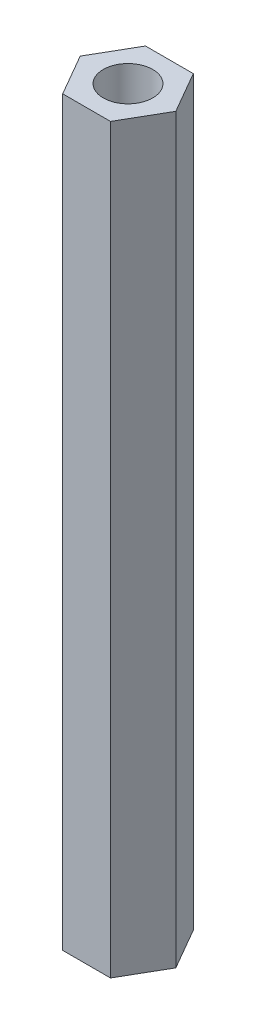
ISO-10303-21;
HEADER;
FILE_DESCRIPTION(('STEP AP214'),'2;1');
FILE_NAME('part.step','',(''),(''),'','','');
FILE_SCHEMA(('AUTOMOTIVE_DESIGN { 1 0 10303 214 1 1 1 1 }'));
ENDSEC;
DATA;
#1=APPLICATION_CONTEXT('core data for automotive mechanical design processes');
#2=APPLICATION_PROTOCOL_DEFINITION('international standard','automotive_design',2000,#1);
#3=PRODUCT_CONTEXT('',#1,'mechanical');
#4=PRODUCT('Part','Part','',(#3));
#5=PRODUCT_RELATED_PRODUCT_CATEGORY('part','',(#4));
#6=PRODUCT_DEFINITION_FORMATION('','',#4);
#7=PRODUCT_DEFINITION_CONTEXT('part definition',#1,'design');
#8=PRODUCT_DEFINITION('design','',#6,#7);
#9=PRODUCT_DEFINITION_SHAPE('','',#8);
#10=(LENGTH_UNIT() NAMED_UNIT(*) SI_UNIT(.MILLI.,.METRE.));
#11=(NAMED_UNIT(*) PLANE_ANGLE_UNIT() SI_UNIT($,.RADIAN.));
#12=(NAMED_UNIT(*) SI_UNIT($,.STERADIAN.) SOLID_ANGLE_UNIT());
#13=UNCERTAINTY_MEASURE_WITH_UNIT(LENGTH_MEASURE(1.E-05),#10,'distance_accuracy_value','');
#14=(GEOMETRIC_REPRESENTATION_CONTEXT(3) GLOBAL_UNCERTAINTY_ASSIGNED_CONTEXT((#13)) GLOBAL_UNIT_ASSIGNED_CONTEXT((#10,
#11,#12)) REPRESENTATION_CONTEXT('',''));
#15=CARTESIAN_POINT('',(0.,0.,0.));
#16=DIRECTION('',(0.,0.,1.));
#17=DIRECTION('',(1.,0.,0.));
#18=AXIS2_PLACEMENT_3D('',#15,#16,#17);
#19=CARTESIAN_POINT('',(1.45,45.,2.51147367097487));
#20=DIRECTION('',(-0.866025403784439,0.,-0.5));
#21=DIRECTION('',(-0.5,0.,0.866025403784439));
#22=AXIS2_PLACEMENT_3D('',#19,#20,#21);
#23=PLANE('',#22);
#24=DIRECTION('',(0.5,0.,-0.866025403784439));
#25=VECTOR('',#24,1.);
#26=CARTESIAN_POINT('',(1.45,0.,2.51147367097487));
#27=LINE('',#26,#25);
#28=CARTESIAN_POINT('',(1.45,0.,2.51147367097487));
#29=VERTEX_POINT('',#28);
#30=CARTESIAN_POINT('',(2.9,0.,0.));
#31=VERTEX_POINT('',#30);
#32=EDGE_CURVE('E134',#29,#31,#27,.T.);
#33=ORIENTED_EDGE('',*,*,#32,.T.);
#34=DIRECTION('',(0.,-1.,0.));
#35=VECTOR('',#34,1.);
#36=CARTESIAN_POINT('',(2.9,45.,0.));
#37=LINE('',#36,#35);
#38=CARTESIAN_POINT('',(2.9,45.,0.));
#39=VERTEX_POINT('',#38);
#40=EDGE_CURVE('E11',#39,#31,#37,.T.);
#41=ORIENTED_EDGE('',*,*,#40,.F.);
#42=DIRECTION('',(0.5,0.,-0.866025403784439));
#43=VECTOR('',#42,1.);
#44=CARTESIAN_POINT('',(1.45,45.,2.51147367097487));
#45=LINE('',#44,#43);
#46=CARTESIAN_POINT('',(1.45,45.,2.51147367097487));
#47=VERTEX_POINT('',#46);
#48=EDGE_CURVE('E151',#47,#39,#45,.T.);
#49=ORIENTED_EDGE('',*,*,#48,.F.);
#50=DIRECTION('',(0.,-1.,0.));
#51=VECTOR('',#50,1.);
#52=CARTESIAN_POINT('',(1.45,45.,2.51147367097487));
#53=LINE('',#52,#51);
#54=EDGE_CURVE('E130',#47,#29,#53,.T.);
#55=ORIENTED_EDGE('',*,*,#54,.T.);
#56=EDGE_LOOP('',(#33,#41,#49,#55));
#57=FACE_BOUND('',#56,.T.);
#58=ADVANCED_FACE('F45',(#57),#23,.F.);
#59=CARTESIAN_POINT('',(2.9,45.,0.));
#60=DIRECTION('',(-0.866025403784439,0.,0.5));
#61=DIRECTION('',(0.5,0.,0.866025403784439));
#62=AXIS2_PLACEMENT_3D('',#59,#60,#61);
#63=PLANE('',#62);
#64=DIRECTION('',(-0.5,0.,-0.866025403784439));
#65=VECTOR('',#64,1.);
#66=CARTESIAN_POINT('',(2.9,0.,0.));
#67=LINE('',#66,#65);
#68=CARTESIAN_POINT('',(1.45,0.,-2.51147367097487));
#69=VERTEX_POINT('',#68);
#70=EDGE_CURVE('E138',#31,#69,#67,.T.);
#71=ORIENTED_EDGE('',*,*,#70,.T.);
#72=DIRECTION('',(0.,-1.,0.));
#73=VECTOR('',#72,1.);
#74=CARTESIAN_POINT('',(1.45,45.,-2.51147367097487));
#75=LINE('',#74,#73);
#76=CARTESIAN_POINT('',(1.45,45.,-2.51147367097487));
#77=VERTEX_POINT('',#76);
#78=EDGE_CURVE('E54',#77,#69,#75,.T.);
#79=ORIENTED_EDGE('',*,*,#78,.F.);
#80=DIRECTION('',(-0.5,0.,-0.866025403784439));
#81=VECTOR('',#80,1.);
#82=CARTESIAN_POINT('',(2.9,45.,0.));
#83=LINE('',#82,#81);
#84=EDGE_CURVE('E99',#39,#77,#83,.T.);
#85=ORIENTED_EDGE('',*,*,#84,.F.);
#86=ORIENTED_EDGE('',*,*,#40,.T.);
#87=EDGE_LOOP('',(#71,#79,#85,#86));
#88=FACE_BOUND('',#87,.T.);
#89=ADVANCED_FACE('F180',(#88),#63,.F.);
#90=CARTESIAN_POINT('',(1.45,45.,-2.51147367097487));
#91=DIRECTION('',(0.,0.,1.));
#92=DIRECTION('',(1.,0.,0.));
#93=AXIS2_PLACEMENT_3D('',#90,#91,#92);
#94=PLANE('',#93);
#95=DIRECTION('',(-1.,0.,0.));
#96=VECTOR('',#95,1.);
#97=CARTESIAN_POINT('',(1.45,0.,-2.51147367097487));
#98=LINE('',#97,#96);
#99=CARTESIAN_POINT('',(-1.45,0.,-2.51147367097487));
#100=VERTEX_POINT('',#99);
#101=EDGE_CURVE('E142',#69,#100,#98,.T.);
#102=ORIENTED_EDGE('',*,*,#101,.T.);
#103=DIRECTION('',(0.,-1.,0.));
#104=VECTOR('',#103,1.);
#105=CARTESIAN_POINT('',(-1.45,45.,-2.51147367097487));
#106=LINE('',#105,#104);
#107=CARTESIAN_POINT('',(-1.45,45.,-2.51147367097487));
#108=VERTEX_POINT('',#107);
#109=EDGE_CURVE('E123',#108,#100,#106,.T.);
#110=ORIENTED_EDGE('',*,*,#109,.F.);
#111=DIRECTION('',(-1.,0.,0.));
#112=VECTOR('',#111,1.);
#113=CARTESIAN_POINT('',(1.45,45.,-2.51147367097487));
#114=LINE('',#113,#112);
#115=EDGE_CURVE('E112',#77,#108,#114,.T.);
#116=ORIENTED_EDGE('',*,*,#115,.F.);
#117=ORIENTED_EDGE('',*,*,#78,.T.);
#118=EDGE_LOOP('',(#102,#110,#116,#117));
#119=FACE_BOUND('',#118,.T.);
#120=ADVANCED_FACE('F161',(#119),#94,.F.);
#121=CARTESIAN_POINT('',(-1.45,45.,-2.51147367097487));
#122=DIRECTION('',(0.866025403784439,0.,0.5));
#123=DIRECTION('',(0.5,0.,-0.866025403784439));
#124=AXIS2_PLACEMENT_3D('',#121,#122,#123);
#125=PLANE('',#124);
#126=DIRECTION('',(-0.5,0.,0.866025403784439));
#127=VECTOR('',#126,1.);
#128=CARTESIAN_POINT('',(-1.45,0.,-2.51147367097487));
#129=LINE('',#128,#127);
#130=CARTESIAN_POINT('',(-2.9,0.,0.));
#131=VERTEX_POINT('',#130);
#132=EDGE_CURVE('E121',#100,#131,#129,.T.);
#133=ORIENTED_EDGE('',*,*,#132,.T.);
#134=DIRECTION('',(0.,-1.,0.));
#135=VECTOR('',#134,1.);
#136=CARTESIAN_POINT('',(-2.9,45.,0.));
#137=LINE('',#136,#135);
#138=CARTESIAN_POINT('',(-2.9,45.,0.));
#139=VERTEX_POINT('',#138);
#140=EDGE_CURVE('E118',#139,#131,#137,.T.);
#141=ORIENTED_EDGE('',*,*,#140,.F.);
#142=DIRECTION('',(-0.5,0.,0.866025403784439));
#143=VECTOR('',#142,1.);
#144=CARTESIAN_POINT('',(-1.45,45.,-2.51147367097487));
#145=LINE('',#144,#143);
#146=EDGE_CURVE('E106',#108,#139,#145,.T.);
#147=ORIENTED_EDGE('',*,*,#146,.F.);
#148=ORIENTED_EDGE('',*,*,#109,.T.);
#149=EDGE_LOOP('',(#133,#141,#147,#148));
#150=FACE_BOUND('',#149,.T.);
#151=ADVANCED_FACE('F119',(#150),#125,.F.);
#152=CARTESIAN_POINT('',(-2.9,45.,0.));
#153=DIRECTION('',(0.866025403784439,0.,-0.5));
#154=DIRECTION('',(-0.5,0.,-0.866025403784439));
#155=AXIS2_PLACEMENT_3D('',#152,#153,#154);
#156=PLANE('',#155);
#157=DIRECTION('',(0.5,0.,0.866025403784439));
#158=VECTOR('',#157,1.);
#159=CARTESIAN_POINT('',(-2.9,0.,0.));
#160=LINE('',#159,#158);
#161=CARTESIAN_POINT('',(-1.45,0.,2.51147367097487));
#162=VERTEX_POINT('',#161);
#163=EDGE_CURVE('E85',#131,#162,#160,.T.);
#164=ORIENTED_EDGE('',*,*,#163,.T.);
#165=DIRECTION('',(0.,-1.,0.));
#166=VECTOR('',#165,1.);
#167=CARTESIAN_POINT('',(-1.45,45.,2.51147367097487));
#168=LINE('',#167,#166);
#169=CARTESIAN_POINT('',(-1.45,45.,2.51147367097487));
#170=VERTEX_POINT('',#169);
#171=EDGE_CURVE('E124',#170,#162,#168,.T.);
#172=ORIENTED_EDGE('',*,*,#171,.F.);
#173=DIRECTION('',(0.5,0.,0.866025403784439));
#174=VECTOR('',#173,1.);
#175=CARTESIAN_POINT('',(-2.9,45.,0.));
#176=LINE('',#175,#174);
#177=EDGE_CURVE('E110',#139,#170,#176,.T.);
#178=ORIENTED_EDGE('',*,*,#177,.F.);
#179=ORIENTED_EDGE('',*,*,#140,.T.);
#180=EDGE_LOOP('',(#164,#172,#178,#179));
#181=FACE_BOUND('',#180,.T.);
#182=ADVANCED_FACE('F126',(#181),#156,.F.);
#183=CARTESIAN_POINT('',(-1.45,45.,2.51147367097487));
#184=DIRECTION('',(0.,0.,-1.));
#185=DIRECTION('',(-1.,0.,0.));
#186=AXIS2_PLACEMENT_3D('',#183,#184,#185);
#187=PLANE('',#186);
#188=DIRECTION('',(1.,0.,0.));
#189=VECTOR('',#188,1.);
#190=CARTESIAN_POINT('',(-1.45,0.,2.51147367097487));
#191=LINE('',#190,#189);
#192=EDGE_CURVE('E91',#162,#29,#191,.T.);
#193=ORIENTED_EDGE('',*,*,#192,.T.);
#194=ORIENTED_EDGE('',*,*,#54,.F.);
#195=DIRECTION('',(1.,0.,0.));
#196=VECTOR('',#195,1.);
#197=CARTESIAN_POINT('',(-1.45,45.,2.51147367097487));
#198=LINE('',#197,#196);
#199=EDGE_CURVE('E62',#170,#47,#198,.T.);
#200=ORIENTED_EDGE('',*,*,#199,.F.);
#201=ORIENTED_EDGE('',*,*,#171,.T.);
#202=EDGE_LOOP('',(#193,#194,#200,#201));
#203=FACE_BOUND('',#202,.T.);
#204=ADVANCED_FACE('F168',(#203),#187,.F.);
#205=CARTESIAN_POINT('',(0.,45.,0.));
#206=DIRECTION('',(0.,1.,0.));
#207=DIRECTION('',(0.,0.,1.));
#208=AXIS2_PLACEMENT_3D('',#205,#206,#207);
#209=PLANE('',#208);
#210=CARTESIAN_POINT('',(0.,45.,0.));
#211=DIRECTION('',(0.,1.,0.));
#212=DIRECTION('',(0.,0.,1.));
#213=AXIS2_PLACEMENT_3D('',#210,#211,#212);
#214=CIRCLE('',#213,1.5);
#215=CARTESIAN_POINT('',(0.,45.,1.5));
#216=VERTEX_POINT('',#215);
#217=EDGE_CURVE('E236',#216,#216,#214,.T.);
#218=ORIENTED_EDGE('',*,*,#217,.F.);
#219=EDGE_LOOP('',(#218));
#220=FACE_BOUND('',#219,.T.);
#221=ORIENTED_EDGE('',*,*,#48,.T.);
#222=ORIENTED_EDGE('',*,*,#84,.T.);
#223=ORIENTED_EDGE('',*,*,#115,.T.);
#224=ORIENTED_EDGE('',*,*,#146,.T.);
#225=ORIENTED_EDGE('',*,*,#177,.T.);
#226=ORIENTED_EDGE('',*,*,#199,.T.);
#227=EDGE_LOOP('',(#221,#222,#223,#224,#225,#226));
#228=FACE_BOUND('',#227,.T.);
#229=ADVANCED_FACE('F108',(#220,#228),#209,.T.);
#230=CARTESIAN_POINT('',(0.,0.,0.));
#231=DIRECTION('',(0.,1.,0.));
#232=DIRECTION('',(0.,0.,1.));
#233=AXIS2_PLACEMENT_3D('',#230,#231,#232);
#234=PLANE('',#233);
#235=CARTESIAN_POINT('',(0.,0.,0.));
#236=DIRECTION('',(0.,1.,0.));
#237=DIRECTION('',(0.,0.,1.));
#238=AXIS2_PLACEMENT_3D('',#235,#236,#237);
#239=CIRCLE('',#238,1.5);
#240=CARTESIAN_POINT('',(0.,0.,1.5));
#241=VERTEX_POINT('',#240);
#242=EDGE_CURVE('E139',#241,#241,#239,.T.);
#243=ORIENTED_EDGE('',*,*,#242,.T.);
#244=EDGE_LOOP('',(#243));
#245=FACE_BOUND('',#244,.T.);
#246=ORIENTED_EDGE('',*,*,#32,.F.);
#247=ORIENTED_EDGE('',*,*,#192,.F.);
#248=ORIENTED_EDGE('',*,*,#163,.F.);
#249=ORIENTED_EDGE('',*,*,#132,.F.);
#250=ORIENTED_EDGE('',*,*,#101,.F.);
#251=ORIENTED_EDGE('',*,*,#70,.F.);
#252=EDGE_LOOP('',(#246,#247,#248,#249,#250,#251));
#253=FACE_BOUND('',#252,.T.);
#254=ADVANCED_FACE('F164',(#245,#253),#234,.F.);
#255=CARTESIAN_POINT('',(0.,0.,0.));
#256=DIRECTION('',(0.,1.,0.));
#257=DIRECTION('',(0.,0.,1.));
#258=AXIS2_PLACEMENT_3D('',#255,#256,#257);
#259=CYLINDRICAL_SURFACE('',#258,1.5);
#260=CARTESIAN_POINT('',(0.,0.,1.5));
#261=CARTESIAN_POINT('',(0.,0.468749999999999,1.5));
#262=CARTESIAN_POINT('',(0.,0.9375,1.5));
#263=CARTESIAN_POINT('',(0.,1.875,1.5));
#264=CARTESIAN_POINT('',(0.,2.34375,1.5));
#265=CARTESIAN_POINT('',(0.,3.28125,1.5));
#266=CARTESIAN_POINT('',(0.,3.75,1.5));
#267=CARTESIAN_POINT('',(0.,4.6875,1.5));
#268=CARTESIAN_POINT('',(0.,5.15625,1.5));
#269=CARTESIAN_POINT('',(0.,6.09375,1.5));
#270=CARTESIAN_POINT('',(0.,6.5625,1.5));
#271=CARTESIAN_POINT('',(0.,7.5,1.5));
#272=CARTESIAN_POINT('',(0.,7.96875,1.5));
#273=CARTESIAN_POINT('',(0.,8.90625,1.5));
#274=CARTESIAN_POINT('',(0.,9.375,1.5));
#275=CARTESIAN_POINT('',(0.,10.3125,1.5));
#276=CARTESIAN_POINT('',(0.,10.78125,1.5));
#277=CARTESIAN_POINT('',(0.,11.71875,1.5));
#278=CARTESIAN_POINT('',(0.,12.1875,1.5));
#279=CARTESIAN_POINT('',(0.,13.125,1.5));
#280=CARTESIAN_POINT('',(0.,13.59375,1.5));
#281=CARTESIAN_POINT('',(0.,14.53125,1.5));
#282=CARTESIAN_POINT('',(0.,15.,1.5));
#283=CARTESIAN_POINT('',(0.,15.9375,1.5));
#284=CARTESIAN_POINT('',(0.,16.40625,1.5));
#285=CARTESIAN_POINT('',(0.,17.34375,1.5));
#286=CARTESIAN_POINT('',(0.,17.8125,1.5));
#287=CARTESIAN_POINT('',(0.,18.75,1.5));
#288=CARTESIAN_POINT('',(0.,19.21875,1.5));
#289=CARTESIAN_POINT('',(0.,20.15625,1.5));
#290=CARTESIAN_POINT('',(0.,20.625,1.5));
#291=CARTESIAN_POINT('',(0.,21.5625,1.5));
#292=CARTESIAN_POINT('',(0.,22.03125,1.5));
#293=CARTESIAN_POINT('',(0.,22.96875,1.5));
#294=CARTESIAN_POINT('',(0.,23.4375,1.5));
#295=CARTESIAN_POINT('',(0.,24.375,1.5));
#296=CARTESIAN_POINT('',(0.,24.84375,1.5));
#297=CARTESIAN_POINT('',(0.,25.78125,1.5));
#298=CARTESIAN_POINT('',(0.,26.25,1.5));
#299=CARTESIAN_POINT('',(0.,27.1875,1.5));
#300=CARTESIAN_POINT('',(0.,27.65625,1.5));
#301=CARTESIAN_POINT('',(0.,28.59375,1.5));
#302=CARTESIAN_POINT('',(0.,29.0625,1.5));
#303=CARTESIAN_POINT('',(0.,30.,1.5));
#304=CARTESIAN_POINT('',(0.,30.46875,1.5));
#305=CARTESIAN_POINT('',(0.,31.40625,1.5));
#306=CARTESIAN_POINT('',(0.,31.875,1.5));
#307=CARTESIAN_POINT('',(0.,32.8125,1.5));
#308=CARTESIAN_POINT('',(0.,33.28125,1.5));
#309=CARTESIAN_POINT('',(0.,34.21875,1.5));
#310=CARTESIAN_POINT('',(0.,34.6875,1.5));
#311=CARTESIAN_POINT('',(0.,35.625,1.5));
#312=CARTESIAN_POINT('',(0.,36.09375,1.5));
#313=CARTESIAN_POINT('',(0.,37.03125,1.5));
#314=CARTESIAN_POINT('',(0.,37.5,1.5));
#315=CARTESIAN_POINT('',(0.,38.4375,1.5));
#316=CARTESIAN_POINT('',(0.,38.90625,1.5));
#317=CARTESIAN_POINT('',(0.,39.84375,1.5));
#318=CARTESIAN_POINT('',(0.,40.3125,1.5));
#319=CARTESIAN_POINT('',(0.,41.25,1.5));
#320=CARTESIAN_POINT('',(0.,41.71875,1.5));
#321=CARTESIAN_POINT('',(0.,42.65625,1.5));
#322=CARTESIAN_POINT('',(0.,43.125,1.5));
#323=CARTESIAN_POINT('',(0.,44.0625,1.5));
#324=CARTESIAN_POINT('',(0.,44.53125,1.5));
#325=CARTESIAN_POINT('',(0.,45.,1.5));
#326=B_SPLINE_CURVE_WITH_KNOTS('',3,(#260,#261,#262,#263,#264,#265,#266,#267,#268,#269,#270,
#271,#272,#273,#274,#275,#276,#277,#278,#279,#280,#281,#282,#283,#284,#285,#286,#287,#288,#289,
#290,#291,#292,#293,#294,#295,#296,#297,#298,#299,#300,#301,#302,#303,#304,#305,#306,#307,#308,
#309,#310,#311,#312,#313,#314,#315,#316,#317,#318,#319,#320,#321,#322,#323,#324,#325),
.UNSPECIFIED.,.F.,.F.,(4,2,2,2,2,2,2,2,2,2,2,2,2,2,2,2,2,2,2,2,2,2,2,2,2,2,2,2,2,2,2,2,4),(0.,
1.40625,2.8125,4.21875,5.625,7.03125,8.4375,9.84375,11.25,12.65625,14.0625,15.46875,16.875,
18.28125,19.6875,21.09375,22.5,23.90625,25.3125,26.71875,28.125,29.53125,30.9375,32.34375,33.75,
35.15625,36.5625,37.96875,39.375,40.78125,42.1875,43.59375,45.),.UNSPECIFIED.);
#327=EDGE_CURVE('BSEAM219',#241,#216,#326,.T.);
#328=ORIENTED_EDGE('',*,*,#242,.F.);
#329=ORIENTED_EDGE('',*,*,#217,.T.);
#330=ORIENTED_EDGE('',*,*,#327,.T.);
#331=ORIENTED_EDGE('',*,*,#327,.F.);
#332=EDGE_LOOP('',(#328,#330,#329,#331));
#333=FACE_BOUND('',#332,.T.);
#334=ADVANCED_FACE('F219',(#333),#259,.F.);
#335=CLOSED_SHELL('',(#58,#89,#120,#151,#182,#204,#229,#254,#334));
#336=MANIFOLD_SOLID_BREP('B2',#335);
#337=ADVANCED_BREP_SHAPE_REPRESENTATION('',(#18,#336),#14);
#338=SHAPE_DEFINITION_REPRESENTATION(#9,#337);
ENDSEC;
END-ISO-10303-21;
